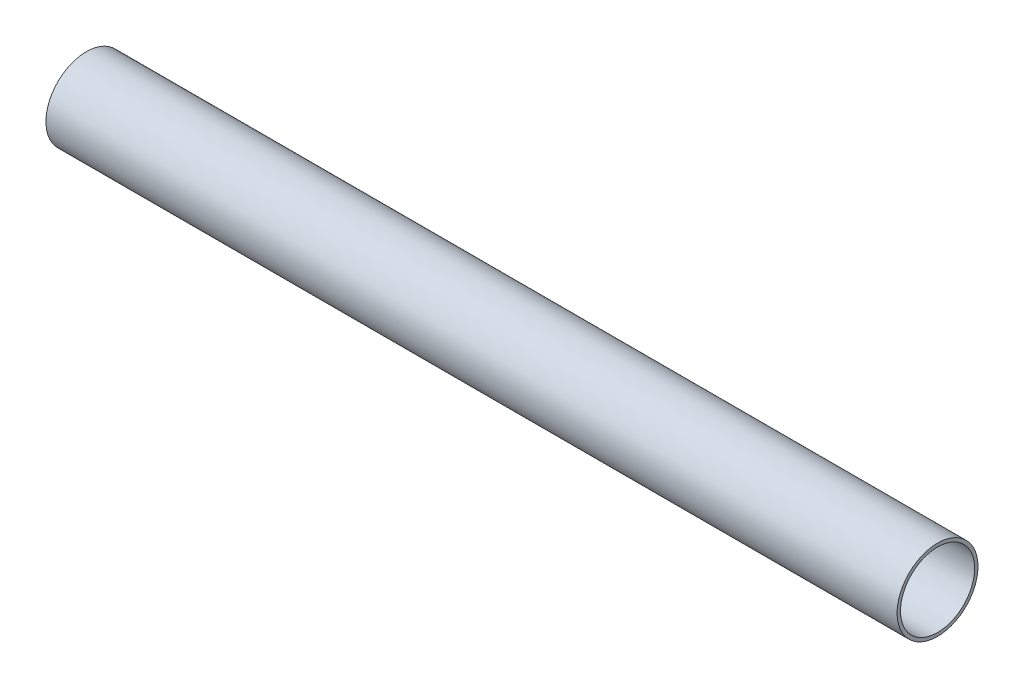
ISO-10303-21;
HEADER;
FILE_DESCRIPTION(('STEP AP214'),'2;1');
FILE_NAME('part.step','',(''),(''),'','','');
FILE_SCHEMA(('AUTOMOTIVE_DESIGN { 1 0 10303 214 1 1 1 1 }'));
ENDSEC;
DATA;
#1=APPLICATION_CONTEXT('core data for automotive mechanical design processes');
#2=APPLICATION_PROTOCOL_DEFINITION('international standard','automotive_design',2000,#1);
#3=PRODUCT_CONTEXT('',#1,'mechanical');
#4=PRODUCT('Part','Part','',(#3));
#5=PRODUCT_RELATED_PRODUCT_CATEGORY('part','',(#4));
#6=PRODUCT_DEFINITION_FORMATION('','',#4);
#7=PRODUCT_DEFINITION_CONTEXT('part definition',#1,'design');
#8=PRODUCT_DEFINITION('design','',#6,#7);
#9=PRODUCT_DEFINITION_SHAPE('','',#8);
#10=(LENGTH_UNIT() NAMED_UNIT(*) SI_UNIT(.MILLI.,.METRE.));
#11=(NAMED_UNIT(*) PLANE_ANGLE_UNIT() SI_UNIT($,.RADIAN.));
#12=(NAMED_UNIT(*) SI_UNIT($,.STERADIAN.) SOLID_ANGLE_UNIT());
#13=UNCERTAINTY_MEASURE_WITH_UNIT(LENGTH_MEASURE(1.E-05),#10,'distance_accuracy_value','');
#14=(GEOMETRIC_REPRESENTATION_CONTEXT(3) GLOBAL_UNCERTAINTY_ASSIGNED_CONTEXT((#13)) GLOBAL_UNIT_ASSIGNED_CONTEXT((#10,
#11,#12)) REPRESENTATION_CONTEXT('',''));
#15=CARTESIAN_POINT('',(0.,0.,0.));
#16=DIRECTION('',(0.,0.,1.));
#17=DIRECTION('',(1.,0.,0.));
#18=AXIS2_PLACEMENT_3D('',#15,#16,#17);
#19=CARTESIAN_POINT('',(400.939,0.,0.));
#20=DIRECTION('',(1.,0.,0.));
#21=DIRECTION('',(0.,0.,-1.));
#22=AXIS2_PLACEMENT_3D('',#19,#20,#21);
#23=PLANE('',#22);
#24=CARTESIAN_POINT('',(400.939,0.,0.));
#25=DIRECTION('',(1.,0.,0.));
#26=DIRECTION('',(0.,0.,-1.));
#27=AXIS2_PLACEMENT_3D('',#24,#25,#26);
#28=CIRCLE('',#27,19.05);
#29=CARTESIAN_POINT('',(400.939,0.,-19.05));
#30=VERTEX_POINT('',#29);
#31=EDGE_CURVE('E10',#30,#30,#28,.T.);
#32=ORIENTED_EDGE('',*,*,#31,.T.);
#33=EDGE_LOOP('',(#32));
#34=FACE_BOUND('',#33,.T.);
#35=CARTESIAN_POINT('',(400.939,0.,0.));
#36=DIRECTION('',(1.,0.,0.));
#37=DIRECTION('',(0.,0.,-1.));
#38=AXIS2_PLACEMENT_3D('',#35,#36,#37);
#39=CIRCLE('',#38,17.4625);
#40=CARTESIAN_POINT('',(400.939,0.,-17.4625));
#41=VERTEX_POINT('',#40);
#42=EDGE_CURVE('E44',#41,#41,#39,.T.);
#43=ORIENTED_EDGE('',*,*,#42,.F.);
#44=EDGE_LOOP('',(#43));
#45=FACE_BOUND('',#44,.T.);
#46=ADVANCED_FACE('F33',(#34,#45),#23,.T.);
#47=CARTESIAN_POINT('',(0.,0.,0.));
#48=DIRECTION('',(1.,0.,0.));
#49=DIRECTION('',(0.,0.,-1.));
#50=AXIS2_PLACEMENT_3D('',#47,#48,#49);
#51=PLANE('',#50);
#52=CARTESIAN_POINT('',(0.,0.,0.));
#53=DIRECTION('',(1.,0.,0.));
#54=DIRECTION('',(0.,0.,-1.));
#55=AXIS2_PLACEMENT_3D('',#52,#53,#54);
#56=CIRCLE('',#55,19.05);
#57=CARTESIAN_POINT('',(0.,0.,-19.05));
#58=VERTEX_POINT('',#57);
#59=EDGE_CURVE('E37',#58,#58,#56,.T.);
#60=ORIENTED_EDGE('',*,*,#59,.F.);
#61=EDGE_LOOP('',(#60));
#62=FACE_BOUND('',#61,.T.);
#63=CARTESIAN_POINT('',(0.,0.,0.));
#64=DIRECTION('',(1.,0.,0.));
#65=DIRECTION('',(0.,0.,-1.));
#66=AXIS2_PLACEMENT_3D('',#63,#64,#65);
#67=CIRCLE('',#66,17.4625);
#68=CARTESIAN_POINT('',(0.,0.,-17.4625));
#69=VERTEX_POINT('',#68);
#70=EDGE_CURVE('E46',#69,#69,#67,.T.);
#71=ORIENTED_EDGE('',*,*,#70,.T.);
#72=EDGE_LOOP('',(#71));
#73=FACE_BOUND('',#72,.T.);
#74=ADVANCED_FACE('F56',(#62,#73),#51,.F.);
#75=CARTESIAN_POINT('',(400.939,0.,0.));
#76=DIRECTION('',(-1.,0.,0.));
#77=DIRECTION('',(0.,0.,1.));
#78=AXIS2_PLACEMENT_3D('',#75,#76,#77);
#79=CYLINDRICAL_SURFACE('',#78,19.05);
#80=ORIENTED_EDGE('',*,*,#31,.F.);
#81=EDGE_LOOP('',(#80));
#82=FACE_BOUND('',#81,.T.);
#83=ORIENTED_EDGE('',*,*,#59,.T.);
#84=EDGE_LOOP('',(#83));
#85=FACE_BOUND('',#84,.T.);
#86=ADVANCED_FACE('F35',(#82,#85),#79,.T.);
#87=CARTESIAN_POINT('',(400.939,0.,0.));
#88=DIRECTION('',(-1.,0.,0.));
#89=DIRECTION('',(0.,0.,1.));
#90=AXIS2_PLACEMENT_3D('',#87,#88,#89);
#91=CYLINDRICAL_SURFACE('',#90,17.4625);
#92=ORIENTED_EDGE('',*,*,#42,.T.);
#93=EDGE_LOOP('',(#92));
#94=FACE_BOUND('',#93,.T.);
#95=ORIENTED_EDGE('',*,*,#70,.F.);
#96=EDGE_LOOP('',(#95));
#97=FACE_BOUND('',#96,.T.);
#98=ADVANCED_FACE('F52',(#94,#97),#91,.F.);
#99=CLOSED_SHELL('',(#46,#74,#86,#98));
#100=MANIFOLD_SOLID_BREP('B2',#99);
#101=ADVANCED_BREP_SHAPE_REPRESENTATION('',(#18,#100),#14);
#102=SHAPE_DEFINITION_REPRESENTATION(#9,#101);
ENDSEC;
END-ISO-10303-21;
